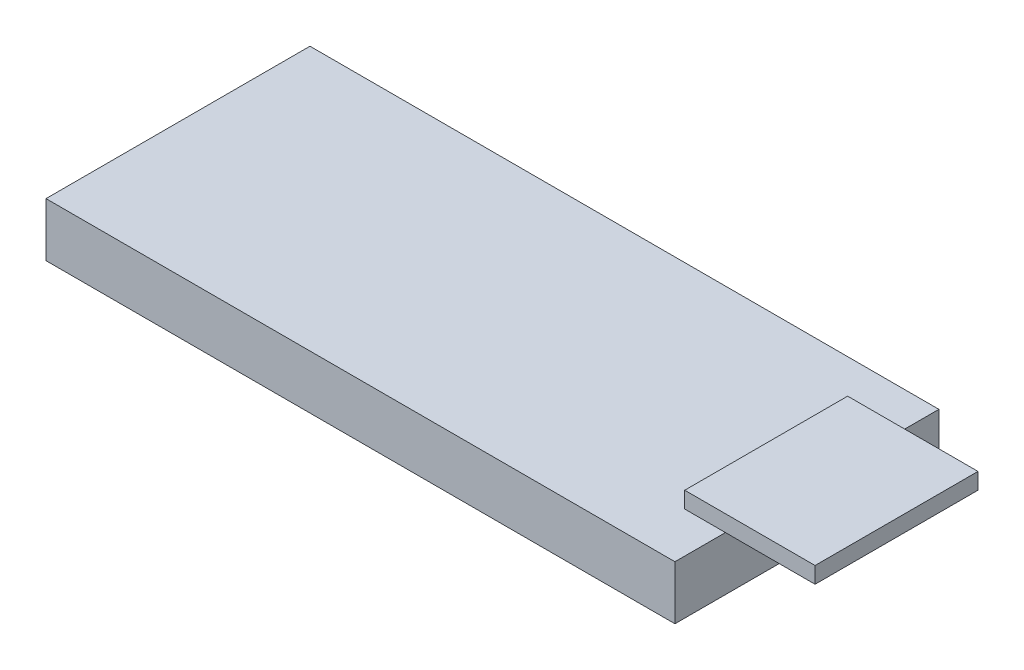
ISO-10303-21;
HEADER;
FILE_DESCRIPTION(('STEP AP214'),'2;1');
FILE_NAME('part.step','',(''),(''),'','','');
FILE_SCHEMA(('AUTOMOTIVE_DESIGN { 1 0 10303 214 1 1 1 1 }'));
ENDSEC;
DATA;
#1=APPLICATION_CONTEXT('core data for automotive mechanical design processes');
#2=APPLICATION_PROTOCOL_DEFINITION('international standard','automotive_design',2000,#1);
#3=PRODUCT_CONTEXT('',#1,'mechanical');
#4=PRODUCT('Part','Part','',(#3));
#5=PRODUCT_RELATED_PRODUCT_CATEGORY('part','',(#4));
#6=PRODUCT_DEFINITION_FORMATION('','',#4);
#7=PRODUCT_DEFINITION_CONTEXT('part definition',#1,'design');
#8=PRODUCT_DEFINITION('design','',#6,#7);
#9=PRODUCT_DEFINITION_SHAPE('','',#8);
#10=(LENGTH_UNIT() NAMED_UNIT(*) SI_UNIT(.MILLI.,.METRE.));
#11=(NAMED_UNIT(*) PLANE_ANGLE_UNIT() SI_UNIT($,.RADIAN.));
#12=(NAMED_UNIT(*) SI_UNIT($,.STERADIAN.) SOLID_ANGLE_UNIT());
#13=UNCERTAINTY_MEASURE_WITH_UNIT(LENGTH_MEASURE(1.E-05),#10,'distance_accuracy_value','');
#14=(GEOMETRIC_REPRESENTATION_CONTEXT(3) GLOBAL_UNCERTAINTY_ASSIGNED_CONTEXT((#13)) GLOBAL_UNIT_ASSIGNED_CONTEXT((#10,
#11,#12)) REPRESENTATION_CONTEXT('',''));
#15=CARTESIAN_POINT('',(0.,0.,0.));
#16=DIRECTION('',(0.,0.,1.));
#17=DIRECTION('',(1.,0.,0.));
#18=AXIS2_PLACEMENT_3D('',#15,#16,#17);
#19=CARTESIAN_POINT('',(38.6,3.3,0.));
#20=DIRECTION('',(-1.,0.,0.));
#21=DIRECTION('',(0.,0.,1.));
#22=AXIS2_PLACEMENT_3D('',#19,#20,#21);
#23=PLANE('',#22);
#24=DIRECTION('',(0.,0.,-1.));
#25=VECTOR('',#24,1.);
#26=CARTESIAN_POINT('',(38.6,3.3,-3.09999999999999));
#27=LINE('',#26,#25);
#28=CARTESIAN_POINT('',(38.6,3.3,-3.09999999999999));
#29=VERTEX_POINT('',#28);
#30=CARTESIAN_POINT('',(38.6,3.3,-13.1));
#31=VERTEX_POINT('',#30);
#32=EDGE_CURVE('E65',#29,#31,#27,.T.);
#33=ORIENTED_EDGE('',*,*,#32,.F.);
#34=DIRECTION('',(0.,0.,-1.));
#35=VECTOR('',#34,1.);
#36=CARTESIAN_POINT('',(38.6,3.3,0.));
#37=LINE('',#36,#35);
#38=CARTESIAN_POINT('',(38.6,3.3,0.));
#39=VERTEX_POINT('',#38);
#40=EDGE_CURVE('E180',#39,#29,#37,.T.);
#41=ORIENTED_EDGE('',*,*,#40,.F.);
#42=DIRECTION('',(0.,-1.,0.));
#43=VECTOR('',#42,1.);
#44=CARTESIAN_POINT('',(38.6,3.3,0.));
#45=LINE('',#44,#43);
#46=CARTESIAN_POINT('',(38.6,0.,0.));
#47=VERTEX_POINT('',#46);
#48=EDGE_CURVE('E50',#39,#47,#45,.T.);
#49=ORIENTED_EDGE('',*,*,#48,.T.);
#50=DIRECTION('',(0.,0.,-1.));
#51=VECTOR('',#50,1.);
#52=CARTESIAN_POINT('',(38.6,0.,0.));
#53=LINE('',#52,#51);
#54=CARTESIAN_POINT('',(38.6,0.,-16.2));
#55=VERTEX_POINT('',#54);
#56=EDGE_CURVE('E193',#47,#55,#53,.T.);
#57=ORIENTED_EDGE('',*,*,#56,.T.);
#58=DIRECTION('',(0.,-1.,0.));
#59=VECTOR('',#58,1.);
#60=CARTESIAN_POINT('',(38.6,3.3,-16.2));
#61=LINE('',#60,#59);
#62=CARTESIAN_POINT('',(38.6,3.3,-16.2));
#63=VERTEX_POINT('',#62);
#64=EDGE_CURVE('E201',#63,#55,#61,.T.);
#65=ORIENTED_EDGE('',*,*,#64,.F.);
#66=EDGE_CURVE('E179',#31,#63,#37,.T.);
#67=ORIENTED_EDGE('',*,*,#66,.F.);
#68=EDGE_LOOP('',(#33,#41,#49,#57,#65,#67));
#69=FACE_BOUND('',#68,.T.);
#70=ADVANCED_FACE('F41',(#69),#23,.F.);
#71=CARTESIAN_POINT('',(0.,3.3,0.));
#72=DIRECTION('',(0.,-1.,0.));
#73=DIRECTION('',(0.,0.,-1.));
#74=AXIS2_PLACEMENT_3D('',#71,#72,#73);
#75=PLANE('',#74);
#76=DIRECTION('',(1.,0.,0.));
#77=VECTOR('',#76,1.);
#78=CARTESIAN_POINT('',(36.1,3.3,-3.09999999999999));
#79=LINE('',#78,#77);
#80=CARTESIAN_POINT('',(36.1,3.3,-3.09999999999999));
#81=VERTEX_POINT('',#80);
#82=EDGE_CURVE('E57',#81,#29,#79,.T.);
#83=ORIENTED_EDGE('',*,*,#82,.F.);
#84=DIRECTION('',(0.,0.,1.));
#85=VECTOR('',#84,1.);
#86=CARTESIAN_POINT('',(36.1,3.3,-3.09999999999999));
#87=LINE('',#86,#85);
#88=CARTESIAN_POINT('',(36.1,3.3,-13.1));
#89=VERTEX_POINT('',#88);
#90=EDGE_CURVE('E145',#89,#81,#87,.T.);
#91=ORIENTED_EDGE('',*,*,#90,.F.);
#92=DIRECTION('',(-1.,0.,0.));
#93=VECTOR('',#92,1.);
#94=CARTESIAN_POINT('',(36.1,3.3,-13.1));
#95=LINE('',#94,#93);
#96=EDGE_CURVE('E140',#31,#89,#95,.T.);
#97=ORIENTED_EDGE('',*,*,#96,.F.);
#98=ORIENTED_EDGE('',*,*,#66,.T.);
#99=DIRECTION('',(-1.,0.,0.));
#100=VECTOR('',#99,1.);
#101=CARTESIAN_POINT('',(0.,3.3,-16.2));
#102=LINE('',#101,#100);
#103=CARTESIAN_POINT('',(0.,3.3,-16.2));
#104=VERTEX_POINT('',#103);
#105=EDGE_CURVE('E183',#63,#104,#102,.T.);
#106=ORIENTED_EDGE('',*,*,#105,.T.);
#107=DIRECTION('',(0.,0.,1.));
#108=VECTOR('',#107,1.);
#109=CARTESIAN_POINT('',(0.,3.3,0.));
#110=LINE('',#109,#108);
#111=CARTESIAN_POINT('',(0.,3.3,0.));
#112=VERTEX_POINT('',#111);
#113=EDGE_CURVE('E171',#104,#112,#110,.T.);
#114=ORIENTED_EDGE('',*,*,#113,.T.);
#115=DIRECTION('',(1.,0.,0.));
#116=VECTOR('',#115,1.);
#117=CARTESIAN_POINT('',(0.,3.3,0.));
#118=LINE('',#117,#116);
#119=EDGE_CURVE('E175',#112,#39,#118,.T.);
#120=ORIENTED_EDGE('',*,*,#119,.T.);
#121=ORIENTED_EDGE('',*,*,#40,.T.);
#122=EDGE_LOOP('',(#83,#91,#97,#98,#106,#114,#120,#121));
#123=FACE_BOUND('',#122,.T.);
#124=ADVANCED_FACE('F221',(#123),#75,.F.);
#125=CARTESIAN_POINT('',(0.,3.3,0.));
#126=DIRECTION('',(1.,0.,0.));
#127=DIRECTION('',(0.,0.,-1.));
#128=AXIS2_PLACEMENT_3D('',#125,#126,#127);
#129=PLANE('',#128);
#130=DIRECTION('',(0.,0.,1.));
#131=VECTOR('',#130,1.);
#132=CARTESIAN_POINT('',(0.,0.,0.));
#133=LINE('',#132,#131);
#134=CARTESIAN_POINT('',(0.,0.,-16.2));
#135=VERTEX_POINT('',#134);
#136=CARTESIAN_POINT('',(0.,0.,0.));
#137=VERTEX_POINT('',#136);
#138=EDGE_CURVE('E170',#135,#137,#133,.T.);
#139=ORIENTED_EDGE('',*,*,#138,.T.);
#140=DIRECTION('',(0.,-1.,0.));
#141=VECTOR('',#140,1.);
#142=CARTESIAN_POINT('',(0.,3.3,0.));
#143=LINE('',#142,#141);
#144=EDGE_CURVE('E11',#112,#137,#143,.T.);
#145=ORIENTED_EDGE('',*,*,#144,.F.);
#146=ORIENTED_EDGE('',*,*,#113,.F.);
#147=DIRECTION('',(0.,-1.,0.));
#148=VECTOR('',#147,1.);
#149=CARTESIAN_POINT('',(0.,3.3,-16.2));
#150=LINE('',#149,#148);
#151=EDGE_CURVE('E186',#104,#135,#150,.T.);
#152=ORIENTED_EDGE('',*,*,#151,.T.);
#153=EDGE_LOOP('',(#139,#145,#146,#152));
#154=FACE_BOUND('',#153,.T.);
#155=ADVANCED_FACE('F43',(#154),#129,.F.);
#156=CARTESIAN_POINT('',(0.,3.3,0.));
#157=DIRECTION('',(0.,0.,-1.));
#158=DIRECTION('',(-1.,0.,0.));
#159=AXIS2_PLACEMENT_3D('',#156,#157,#158);
#160=PLANE('',#159);
#161=DIRECTION('',(1.,0.,0.));
#162=VECTOR('',#161,1.);
#163=CARTESIAN_POINT('',(0.,0.,0.));
#164=LINE('',#163,#162);
#165=EDGE_CURVE('E190',#137,#47,#164,.T.);
#166=ORIENTED_EDGE('',*,*,#165,.T.);
#167=ORIENTED_EDGE('',*,*,#48,.F.);
#168=ORIENTED_EDGE('',*,*,#119,.F.);
#169=ORIENTED_EDGE('',*,*,#144,.T.);
#170=EDGE_LOOP('',(#166,#167,#168,#169));
#171=FACE_BOUND('',#170,.T.);
#172=ADVANCED_FACE('F254',(#171),#160,.F.);
#173=CARTESIAN_POINT('',(0.,3.3,-16.2));
#174=DIRECTION('',(0.,0.,1.));
#175=DIRECTION('',(1.,0.,0.));
#176=AXIS2_PLACEMENT_3D('',#173,#174,#175);
#177=PLANE('',#176);
#178=DIRECTION('',(-1.,0.,0.));
#179=VECTOR('',#178,1.);
#180=CARTESIAN_POINT('',(0.,0.,-16.2));
#181=LINE('',#180,#179);
#182=EDGE_CURVE('E176',#55,#135,#181,.T.);
#183=ORIENTED_EDGE('',*,*,#182,.T.);
#184=ORIENTED_EDGE('',*,*,#151,.F.);
#185=ORIENTED_EDGE('',*,*,#105,.F.);
#186=ORIENTED_EDGE('',*,*,#64,.T.);
#187=EDGE_LOOP('',(#183,#184,#185,#186));
#188=FACE_BOUND('',#187,.T.);
#189=ADVANCED_FACE('F216',(#188),#177,.F.);
#190=CARTESIAN_POINT('',(0.,0.,0.));
#191=DIRECTION('',(0.,-1.,0.));
#192=DIRECTION('',(0.,0.,-1.));
#193=AXIS2_PLACEMENT_3D('',#190,#191,#192);
#194=PLANE('',#193);
#195=ORIENTED_EDGE('',*,*,#138,.F.);
#196=ORIENTED_EDGE('',*,*,#182,.F.);
#197=ORIENTED_EDGE('',*,*,#56,.F.);
#198=ORIENTED_EDGE('',*,*,#165,.F.);
#199=EDGE_LOOP('',(#195,#196,#197,#198));
#200=FACE_BOUND('',#199,.T.);
#201=ADVANCED_FACE('F213',(#200),#194,.T.);
#202=CARTESIAN_POINT('',(36.1,4.3,-13.1));
#203=DIRECTION('',(0.,0.,1.));
#204=DIRECTION('',(1.,0.,0.));
#205=AXIS2_PLACEMENT_3D('',#202,#203,#204);
#206=PLANE('',#205);
#207=ORIENTED_EDGE('',*,*,#96,.T.);
#208=DIRECTION('',(0.,-1.,0.));
#209=VECTOR('',#208,1.);
#210=CARTESIAN_POINT('',(36.1,4.3,-13.1));
#211=LINE('',#210,#209);
#212=CARTESIAN_POINT('',(36.1,4.3,-13.1));
#213=VERTEX_POINT('',#212);
#214=EDGE_CURVE('E166',#213,#89,#211,.T.);
#215=ORIENTED_EDGE('',*,*,#214,.F.);
#216=DIRECTION('',(-1.,0.,0.));
#217=VECTOR('',#216,1.);
#218=CARTESIAN_POINT('',(36.1,4.3,-13.1));
#219=LINE('',#218,#217);
#220=CARTESIAN_POINT('',(44.1,4.3,-13.1));
#221=VERTEX_POINT('',#220);
#222=EDGE_CURVE('E150',#221,#213,#219,.T.);
#223=ORIENTED_EDGE('',*,*,#222,.F.);
#224=DIRECTION('',(0.,1.,0.));
#225=VECTOR('',#224,1.);
#226=CARTESIAN_POINT('',(44.1,4.3,-13.1));
#227=LINE('',#226,#225);
#228=CARTESIAN_POINT('',(44.1,3.3,-13.1));
#229=VERTEX_POINT('',#228);
#230=EDGE_CURVE('E125',#229,#221,#227,.T.);
#231=ORIENTED_EDGE('',*,*,#230,.F.);
#232=DIRECTION('',(-1.,0.,0.));
#233=VECTOR('',#232,1.);
#234=CARTESIAN_POINT('',(44.1,3.3,-13.1));
#235=LINE('',#234,#233);
#236=EDGE_CURVE('E120',#229,#31,#235,.T.);
#237=ORIENTED_EDGE('',*,*,#236,.T.);
#238=EDGE_LOOP('',(#207,#215,#223,#231,#237));
#239=FACE_BOUND('',#238,.T.);
#240=ADVANCED_FACE('F227',(#239),#206,.F.);
#241=CARTESIAN_POINT('',(36.1,4.3,-3.09999999999999));
#242=DIRECTION('',(1.,0.,0.));
#243=DIRECTION('',(0.,0.,-1.));
#244=AXIS2_PLACEMENT_3D('',#241,#242,#243);
#245=PLANE('',#244);
#246=ORIENTED_EDGE('',*,*,#90,.T.);
#247=DIRECTION('',(0.,-1.,0.));
#248=VECTOR('',#247,1.);
#249=CARTESIAN_POINT('',(36.1,4.3,-3.09999999999999));
#250=LINE('',#249,#248);
#251=CARTESIAN_POINT('',(36.1,4.3,-3.09999999999999));
#252=VERTEX_POINT('',#251);
#253=EDGE_CURVE('E158',#252,#81,#250,.T.);
#254=ORIENTED_EDGE('',*,*,#253,.F.);
#255=DIRECTION('',(0.,0.,1.));
#256=VECTOR('',#255,1.);
#257=CARTESIAN_POINT('',(36.1,4.3,-3.09999999999999));
#258=LINE('',#257,#256);
#259=EDGE_CURVE('E153',#213,#252,#258,.T.);
#260=ORIENTED_EDGE('',*,*,#259,.F.);
#261=ORIENTED_EDGE('',*,*,#214,.T.);
#262=EDGE_LOOP('',(#246,#254,#260,#261));
#263=FACE_BOUND('',#262,.T.);
#264=ADVANCED_FACE('F237',(#263),#245,.F.);
#265=CARTESIAN_POINT('',(36.1,4.3,-3.09999999999999));
#266=DIRECTION('',(0.,0.,-1.));
#267=DIRECTION('',(-1.,0.,0.));
#268=AXIS2_PLACEMENT_3D('',#265,#266,#267);
#269=PLANE('',#268);
#270=ORIENTED_EDGE('',*,*,#82,.T.);
#271=DIRECTION('',(-1.,0.,0.));
#272=VECTOR('',#271,1.);
#273=CARTESIAN_POINT('',(44.1,3.3,-3.09999999999999));
#274=LINE('',#273,#272);
#275=CARTESIAN_POINT('',(44.1,3.3,-3.09999999999999));
#276=VERTEX_POINT('',#275);
#277=EDGE_CURVE('E118',#276,#29,#274,.T.);
#278=ORIENTED_EDGE('',*,*,#277,.F.);
#279=DIRECTION('',(0.,-1.,0.));
#280=VECTOR('',#279,1.);
#281=CARTESIAN_POINT('',(44.1,4.3,-3.09999999999999));
#282=LINE('',#281,#280);
#283=CARTESIAN_POINT('',(44.1,4.3,-3.09999999999999));
#284=VERTEX_POINT('',#283);
#285=EDGE_CURVE('E126',#284,#276,#282,.T.);
#286=ORIENTED_EDGE('',*,*,#285,.F.);
#287=DIRECTION('',(1.,0.,0.));
#288=VECTOR('',#287,1.);
#289=CARTESIAN_POINT('',(36.1,4.3,-3.09999999999999));
#290=LINE('',#289,#288);
#291=EDGE_CURVE('E156',#252,#284,#290,.T.);
#292=ORIENTED_EDGE('',*,*,#291,.F.);
#293=ORIENTED_EDGE('',*,*,#253,.T.);
#294=EDGE_LOOP('',(#270,#278,#286,#292,#293));
#295=FACE_BOUND('',#294,.T.);
#296=ADVANCED_FACE('F137',(#295),#269,.F.);
#297=CARTESIAN_POINT('',(0.,4.3,0.));
#298=DIRECTION('',(0.,-1.,0.));
#299=DIRECTION('',(0.,0.,-1.));
#300=AXIS2_PLACEMENT_3D('',#297,#298,#299);
#301=PLANE('',#300);
#302=ORIENTED_EDGE('',*,*,#291,.T.);
#303=DIRECTION('',(0.,0.,1.));
#304=VECTOR('',#303,1.);
#305=CARTESIAN_POINT('',(44.1,4.3,-3.09999999999999));
#306=LINE('',#305,#304);
#307=EDGE_CURVE('E132',#221,#284,#306,.T.);
#308=ORIENTED_EDGE('',*,*,#307,.F.);
#309=ORIENTED_EDGE('',*,*,#222,.T.);
#310=ORIENTED_EDGE('',*,*,#259,.T.);
#311=EDGE_LOOP('',(#302,#308,#309,#310));
#312=FACE_BOUND('',#311,.T.);
#313=ADVANCED_FACE('F233',(#312),#301,.F.);
#314=CARTESIAN_POINT('',(44.1,3.3,-3.09999999999999));
#315=DIRECTION('',(0.,1.,0.));
#316=DIRECTION('',(0.,0.,1.));
#317=AXIS2_PLACEMENT_3D('',#314,#315,#316);
#318=PLANE('',#317);
#319=ORIENTED_EDGE('',*,*,#32,.T.);
#320=ORIENTED_EDGE('',*,*,#236,.F.);
#321=DIRECTION('',(0.,0.,-1.));
#322=VECTOR('',#321,1.);
#323=CARTESIAN_POINT('',(44.1,3.3,-3.09999999999999));
#324=LINE('',#323,#322);
#325=EDGE_CURVE('E114',#276,#229,#324,.T.);
#326=ORIENTED_EDGE('',*,*,#325,.F.);
#327=ORIENTED_EDGE('',*,*,#277,.T.);
#328=EDGE_LOOP('',(#319,#320,#326,#327));
#329=FACE_BOUND('',#328,.T.);
#330=ADVANCED_FACE('F116',(#329),#318,.F.);
#331=CARTESIAN_POINT('',(44.1,0.,0.));
#332=DIRECTION('',(1.,0.,0.));
#333=DIRECTION('',(0.,0.,-1.));
#334=AXIS2_PLACEMENT_3D('',#331,#332,#333);
#335=PLANE('',#334);
#336=ORIENTED_EDGE('',*,*,#285,.T.);
#337=ORIENTED_EDGE('',*,*,#325,.T.);
#338=ORIENTED_EDGE('',*,*,#230,.T.);
#339=ORIENTED_EDGE('',*,*,#307,.T.);
#340=EDGE_LOOP('',(#336,#337,#338,#339));
#341=FACE_BOUND('',#340,.T.);
#342=ADVANCED_FACE('F130',(#341),#335,.T.);
#343=CLOSED_SHELL('',(#70,#124,#155,#172,#189,#201,#240,#264,#296,#313,#330,#342));
#344=MANIFOLD_SOLID_BREP('B2',#343);
#345=ADVANCED_BREP_SHAPE_REPRESENTATION('',(#18,#344),#14);
#346=SHAPE_DEFINITION_REPRESENTATION(#9,#345);
ENDSEC;
END-ISO-10303-21;
